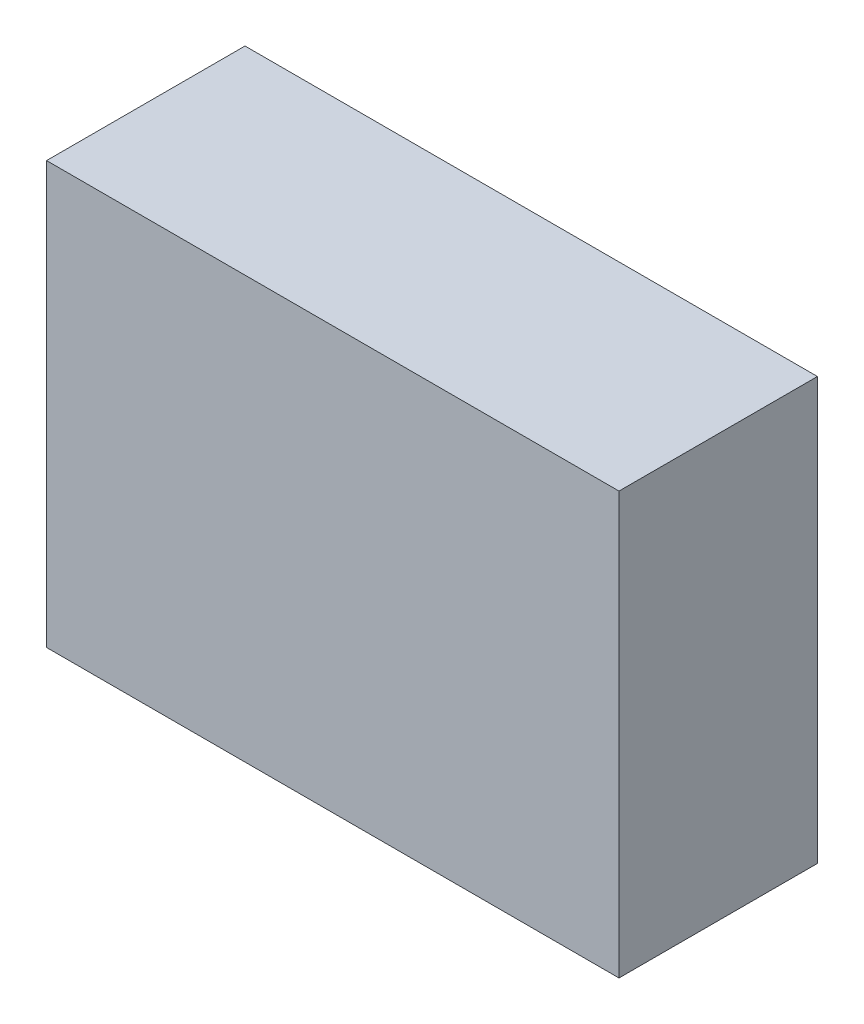
ISO-10303-21;
HEADER;
FILE_DESCRIPTION(('STEP AP214'),'2;1');
FILE_NAME('part.step','',(''),(''),'','','');
FILE_SCHEMA(('AUTOMOTIVE_DESIGN { 1 0 10303 214 1 1 1 1 }'));
ENDSEC;
DATA;
#1=APPLICATION_CONTEXT('core data for automotive mechanical design processes');
#2=APPLICATION_PROTOCOL_DEFINITION('international standard','automotive_design',2000,#1);
#3=PRODUCT_CONTEXT('',#1,'mechanical');
#4=PRODUCT('Part','Part','',(#3));
#5=PRODUCT_RELATED_PRODUCT_CATEGORY('part','',(#4));
#6=PRODUCT_DEFINITION_FORMATION('','',#4);
#7=PRODUCT_DEFINITION_CONTEXT('part definition',#1,'design');
#8=PRODUCT_DEFINITION('design','',#6,#7);
#9=PRODUCT_DEFINITION_SHAPE('','',#8);
#10=(LENGTH_UNIT() NAMED_UNIT(*) SI_UNIT(.MILLI.,.METRE.));
#11=(NAMED_UNIT(*) PLANE_ANGLE_UNIT() SI_UNIT($,.RADIAN.));
#12=(NAMED_UNIT(*) SI_UNIT($,.STERADIAN.) SOLID_ANGLE_UNIT());
#13=UNCERTAINTY_MEASURE_WITH_UNIT(LENGTH_MEASURE(1.E-05),#10,'distance_accuracy_value','');
#14=(GEOMETRIC_REPRESENTATION_CONTEXT(3) GLOBAL_UNCERTAINTY_ASSIGNED_CONTEXT((#13)) GLOBAL_UNIT_ASSIGNED_CONTEXT((#10,
#11,#12)) REPRESENTATION_CONTEXT('',''));
#15=CARTESIAN_POINT('',(0.,0.,0.));
#16=DIRECTION('',(0.,0.,1.));
#17=DIRECTION('',(1.,0.,0.));
#18=AXIS2_PLACEMENT_3D('',#15,#16,#17);
#19=CARTESIAN_POINT('',(-1.561592,4.82597459999999,4.6500034));
#20=DIRECTION('',(1.,0.,0.));
#21=DIRECTION('',(0.,0.,-1.));
#22=AXIS2_PLACEMENT_3D('',#19,#20,#21);
#23=PLANE('',#22);
#24=DIRECTION('',(0.,-1.,0.));
#25=VECTOR('',#24,1.);
#26=CARTESIAN_POINT('',(-1.561592,4.82597459999999,0.));
#27=LINE('',#26,#25);
#28=CARTESIAN_POINT('',(-1.561592,4.82597459999999,0.));
#29=VERTEX_POINT('',#28);
#30=CARTESIAN_POINT('',(-1.561592,-5.05556519999999,0.));
#31=VERTEX_POINT('',#30);
#32=EDGE_CURVE('E95',#29,#31,#27,.T.);
#33=ORIENTED_EDGE('',*,*,#32,.T.);
#34=DIRECTION('',(0.,0.,-1.));
#35=VECTOR('',#34,1.);
#36=CARTESIAN_POINT('',(-1.561592,-5.05556519999999,4.6500034));
#37=LINE('',#36,#35);
#38=CARTESIAN_POINT('',(-1.561592,-5.05556519999999,4.6500034));
#39=VERTEX_POINT('',#38);
#40=EDGE_CURVE('E11',#39,#31,#37,.T.);
#41=ORIENTED_EDGE('',*,*,#40,.F.);
#42=DIRECTION('',(0.,-1.,0.));
#43=VECTOR('',#42,1.);
#44=CARTESIAN_POINT('',(-1.561592,4.82597459999999,4.6500034));
#45=LINE('',#44,#43);
#46=CARTESIAN_POINT('',(-1.561592,4.82597459999999,4.6500034));
#47=VERTEX_POINT('',#46);
#48=EDGE_CURVE('E83',#47,#39,#45,.T.);
#49=ORIENTED_EDGE('',*,*,#48,.F.);
#50=DIRECTION('',(0.,0.,-1.));
#51=VECTOR('',#50,1.);
#52=CARTESIAN_POINT('',(-1.561592,4.82597459999999,4.6500034));
#53=LINE('',#52,#51);
#54=EDGE_CURVE('E91',#47,#29,#53,.T.);
#55=ORIENTED_EDGE('',*,*,#54,.T.);
#56=EDGE_LOOP('',(#33,#41,#49,#55));
#57=FACE_BOUND('',#56,.T.);
#58=ADVANCED_FACE('F32',(#57),#23,.F.);
#59=CARTESIAN_POINT('',(-1.561592,-5.05556519999999,4.6500034));
#60=DIRECTION('',(0.,1.,0.));
#61=DIRECTION('',(0.,0.,1.));
#62=AXIS2_PLACEMENT_3D('',#59,#60,#61);
#63=PLANE('',#62);
#64=DIRECTION('',(1.,0.,0.));
#65=VECTOR('',#64,1.);
#66=CARTESIAN_POINT('',(-1.561592,-5.05556519999999,0.));
#67=LINE('',#66,#65);
#68=CARTESIAN_POINT('',(11.8515892,-5.05556519999999,0.));
#69=VERTEX_POINT('',#68);
#70=EDGE_CURVE('E87',#31,#69,#67,.T.);
#71=ORIENTED_EDGE('',*,*,#70,.T.);
#72=DIRECTION('',(0.,0.,-1.));
#73=VECTOR('',#72,1.);
#74=CARTESIAN_POINT('',(11.8515892,-5.05556519999999,4.6500034));
#75=LINE('',#74,#73);
#76=CARTESIAN_POINT('',(11.8515892,-5.05556519999999,4.6500034));
#77=VERTEX_POINT('',#76);
#78=EDGE_CURVE('E40',#77,#69,#75,.T.);
#79=ORIENTED_EDGE('',*,*,#78,.F.);
#80=DIRECTION('',(1.,0.,0.));
#81=VECTOR('',#80,1.);
#82=CARTESIAN_POINT('',(-1.561592,-5.05556519999999,4.6500034));
#83=LINE('',#82,#81);
#84=EDGE_CURVE('E78',#39,#77,#83,.T.);
#85=ORIENTED_EDGE('',*,*,#84,.F.);
#86=ORIENTED_EDGE('',*,*,#40,.T.);
#87=EDGE_LOOP('',(#71,#79,#85,#86));
#88=FACE_BOUND('',#87,.T.);
#89=ADVANCED_FACE('F86',(#88),#63,.F.);
#90=CARTESIAN_POINT('',(11.8515892,-5.05556519999999,4.6500034));
#91=DIRECTION('',(-1.,0.,0.));
#92=DIRECTION('',(0.,0.,1.));
#93=AXIS2_PLACEMENT_3D('',#90,#91,#92);
#94=PLANE('',#93);
#95=DIRECTION('',(0.,1.,0.));
#96=VECTOR('',#95,1.);
#97=CARTESIAN_POINT('',(11.8515892,-5.05556519999999,0.));
#98=LINE('',#97,#96);
#99=CARTESIAN_POINT('',(11.8515892,4.82597459999999,0.));
#100=VERTEX_POINT('',#99);
#101=EDGE_CURVE('E65',#69,#100,#98,.T.);
#102=ORIENTED_EDGE('',*,*,#101,.T.);
#103=DIRECTION('',(0.,0.,-1.));
#104=VECTOR('',#103,1.);
#105=CARTESIAN_POINT('',(11.8515892,4.82597459999999,4.6500034));
#106=LINE('',#105,#104);
#107=CARTESIAN_POINT('',(11.8515892,4.82597459999999,4.6500034));
#108=VERTEX_POINT('',#107);
#109=EDGE_CURVE('E88',#108,#100,#106,.T.);
#110=ORIENTED_EDGE('',*,*,#109,.F.);
#111=DIRECTION('',(0.,1.,0.));
#112=VECTOR('',#111,1.);
#113=CARTESIAN_POINT('',(11.8515892,-5.05556519999999,4.6500034));
#114=LINE('',#113,#112);
#115=EDGE_CURVE('E81',#77,#108,#114,.T.);
#116=ORIENTED_EDGE('',*,*,#115,.F.);
#117=ORIENTED_EDGE('',*,*,#78,.T.);
#118=EDGE_LOOP('',(#102,#110,#116,#117));
#119=FACE_BOUND('',#118,.T.);
#120=ADVANCED_FACE('F89',(#119),#94,.F.);
#121=CARTESIAN_POINT('',(11.8515892,4.82597459999999,4.6500034));
#122=DIRECTION('',(0.,-1.,0.));
#123=DIRECTION('',(0.,0.,-1.));
#124=AXIS2_PLACEMENT_3D('',#121,#122,#123);
#125=PLANE('',#124);
#126=DIRECTION('',(-1.,0.,0.));
#127=VECTOR('',#126,1.);
#128=CARTESIAN_POINT('',(11.8515892,4.82597459999999,0.));
#129=LINE('',#128,#127);
#130=EDGE_CURVE('E71',#100,#29,#129,.T.);
#131=ORIENTED_EDGE('',*,*,#130,.T.);
#132=ORIENTED_EDGE('',*,*,#54,.F.);
#133=DIRECTION('',(-1.,0.,0.));
#134=VECTOR('',#133,1.);
#135=CARTESIAN_POINT('',(11.8515892,4.82597459999999,4.6500034));
#136=LINE('',#135,#134);
#137=EDGE_CURVE('E48',#108,#47,#136,.T.);
#138=ORIENTED_EDGE('',*,*,#137,.F.);
#139=ORIENTED_EDGE('',*,*,#109,.T.);
#140=EDGE_LOOP('',(#131,#132,#138,#139));
#141=FACE_BOUND('',#140,.T.);
#142=ADVANCED_FACE('F102',(#141),#125,.F.);
#143=CARTESIAN_POINT('',(0.,0.,4.6500034));
#144=DIRECTION('',(0.,0.,1.));
#145=DIRECTION('',(1.,0.,0.));
#146=AXIS2_PLACEMENT_3D('',#143,#144,#145);
#147=PLANE('',#146);
#148=ORIENTED_EDGE('',*,*,#48,.T.);
#149=ORIENTED_EDGE('',*,*,#84,.T.);
#150=ORIENTED_EDGE('',*,*,#115,.T.);
#151=ORIENTED_EDGE('',*,*,#137,.T.);
#152=EDGE_LOOP('',(#148,#149,#150,#151));
#153=FACE_BOUND('',#152,.T.);
#154=ADVANCED_FACE('F79',(#153),#147,.T.);
#155=CARTESIAN_POINT('',(0.,0.,0.));
#156=DIRECTION('',(0.,0.,1.));
#157=DIRECTION('',(1.,0.,0.));
#158=AXIS2_PLACEMENT_3D('',#155,#156,#157);
#159=PLANE('',#158);
#160=ORIENTED_EDGE('',*,*,#32,.F.);
#161=ORIENTED_EDGE('',*,*,#130,.F.);
#162=ORIENTED_EDGE('',*,*,#101,.F.);
#163=ORIENTED_EDGE('',*,*,#70,.F.);
#164=EDGE_LOOP('',(#160,#161,#162,#163));
#165=FACE_BOUND('',#164,.T.);
#166=ADVANCED_FACE('F105',(#165),#159,.F.);
#167=CLOSED_SHELL('',(#58,#89,#120,#142,#154,#166));
#168=MANIFOLD_SOLID_BREP('B2',#167);
#169=ADVANCED_BREP_SHAPE_REPRESENTATION('',(#18,#168),#14);
#170=SHAPE_DEFINITION_REPRESENTATION(#9,#169);
ENDSEC;
END-ISO-10303-21;
